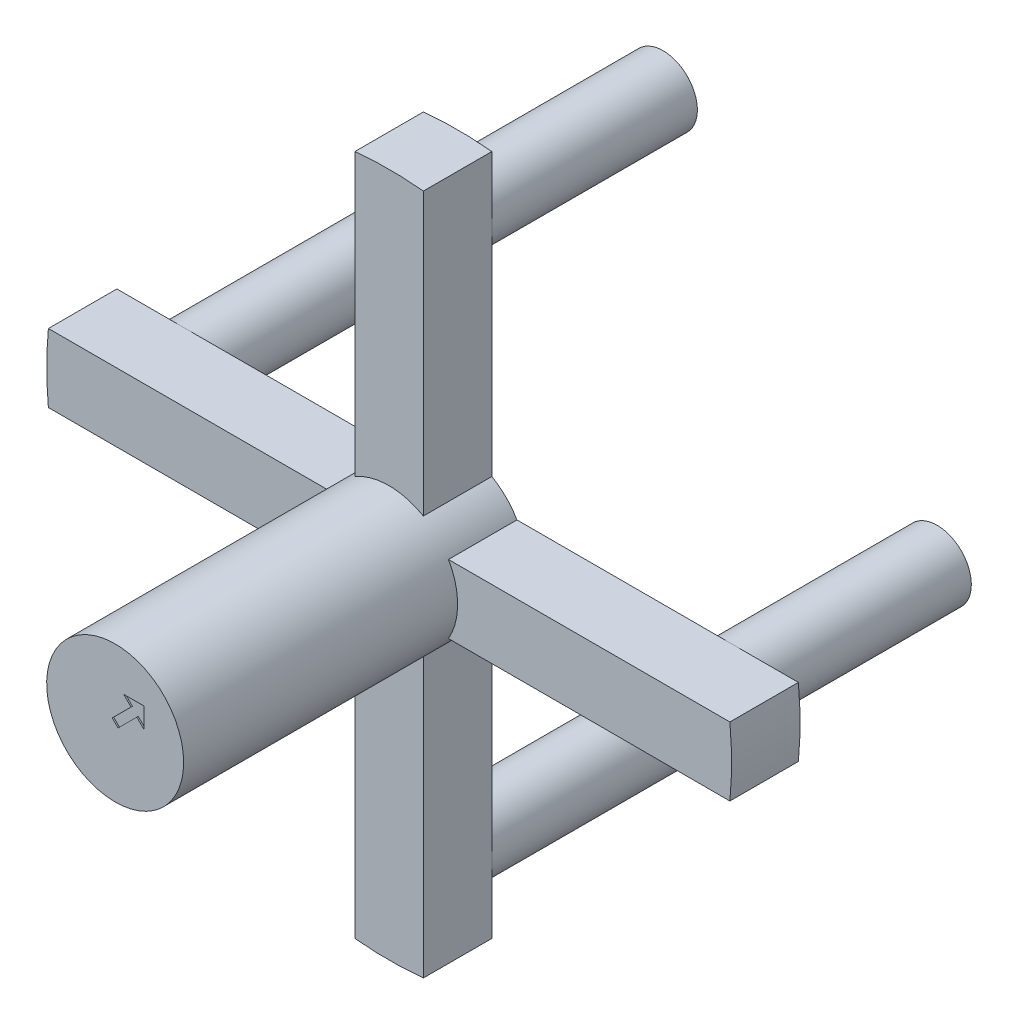
ISO-10303-21;
HEADER;
FILE_DESCRIPTION(('STEP AP214'),'2;1');
FILE_NAME('part.step','',(''),(''),'','','');
FILE_SCHEMA(('AUTOMOTIVE_DESIGN { 1 0 10303 214 1 1 1 1 }'));
ENDSEC;
DATA;
#1=APPLICATION_CONTEXT('core data for automotive mechanical design processes');
#2=APPLICATION_PROTOCOL_DEFINITION('international standard','automotive_design',2000,#1);
#3=PRODUCT_CONTEXT('',#1,'mechanical');
#4=PRODUCT('Part','Part','',(#3));
#5=PRODUCT_RELATED_PRODUCT_CATEGORY('part','',(#4));
#6=PRODUCT_DEFINITION_FORMATION('','',#4);
#7=PRODUCT_DEFINITION_CONTEXT('part definition',#1,'design');
#8=PRODUCT_DEFINITION('design','',#6,#7);
#9=PRODUCT_DEFINITION_SHAPE('','',#8);
#10=(LENGTH_UNIT() NAMED_UNIT(*) SI_UNIT(.MILLI.,.METRE.));
#11=(NAMED_UNIT(*) PLANE_ANGLE_UNIT() SI_UNIT($,.RADIAN.));
#12=(NAMED_UNIT(*) SI_UNIT($,.STERADIAN.) SOLID_ANGLE_UNIT());
#13=UNCERTAINTY_MEASURE_WITH_UNIT(LENGTH_MEASURE(1.E-05),#10,'distance_accuracy_value','');
#14=(GEOMETRIC_REPRESENTATION_CONTEXT(3) GLOBAL_UNCERTAINTY_ASSIGNED_CONTEXT((#13)) GLOBAL_UNIT_ASSIGNED_CONTEXT((#10,
#11,#12)) REPRESENTATION_CONTEXT('',''));
#15=CARTESIAN_POINT('',(0.,0.,0.));
#16=DIRECTION('',(0.,0.,1.));
#17=DIRECTION('',(1.,0.,0.));
#18=AXIS2_PLACEMENT_3D('',#15,#16,#17);
#19=CARTESIAN_POINT('',(0.,0.,20.));
#20=DIRECTION('',(0.,0.,1.));
#21=DIRECTION('',(1.,0.,0.));
#22=AXIS2_PLACEMENT_3D('',#19,#20,#21);
#23=PLANE('',#22);
#24=CARTESIAN_POINT('',(0.,0.,20.));
#25=DIRECTION('',(0.,0.,1.));
#26=DIRECTION('',(1.,0.,0.));
#27=AXIS2_PLACEMENT_3D('',#24,#25,#26);
#28=CIRCLE('',#27,5.);
#29=CARTESIAN_POINT('',(5.,0.,20.));
#30=VERTEX_POINT('',#29);
#31=EDGE_CURVE('E508',#30,#30,#28,.T.);
#32=ORIENTED_EDGE('',*,*,#31,.T.);
#33=EDGE_LOOP('',(#32));
#34=FACE_BOUND('',#33,.T.);
#35=DIRECTION('',(0.70710678118644,0.707106781186655,0.));
#36=VECTOR('',#35,1.);
#37=CARTESIAN_POINT('',(-0.212132034355997,0.212132034355932,20.));
#38=LINE('',#37,#36);
#39=CARTESIAN_POINT('',(-0.212132034355964,0.212132034355965,20.));
#40=VERTEX_POINT('',#39);
#41=CARTESIAN_POINT('',(1.15918830920348,1.58345237791583,20.));
#42=VERTEX_POINT('',#41);
#43=EDGE_CURVE('E272',#40,#42,#38,.T.);
#44=ORIENTED_EDGE('',*,*,#43,.T.);
#45=DIRECTION('',(-0.707106781186654,0.707106781186441,0.));
#46=VECTOR('',#45,1.);
#47=CARTESIAN_POINT('',(1.37132034355948,1.37132034355989,20.));
#48=LINE('',#47,#46);
#49=CARTESIAN_POINT('',(0.621320343559372,2.12132034355977,20.));
#50=VERTEX_POINT('',#49);
#51=EDGE_CURVE('E61',#42,#50,#48,.T.);
#52=ORIENTED_EDGE('',*,*,#51,.T.);
#53=DIRECTION('',(1.,1.49764460092666E-13,0.));
#54=VECTOR('',#53,1.);
#55=CARTESIAN_POINT('',(-3.17698395936805E-13,2.12132034355968,20.));
#56=LINE('',#55,#54);
#57=CARTESIAN_POINT('',(2.12132034355935,2.12132034356,20.));
#58=VERTEX_POINT('',#57);
#59=EDGE_CURVE('E249',#50,#58,#56,.T.);
#60=ORIENTED_EDGE('',*,*,#59,.T.);
#61=DIRECTION('',(1.49764460092666E-13,-1.,0.));
#62=VECTOR('',#61,1.);
#63=CARTESIAN_POINT('',(2.12132034355967,3.17698395936804E-13,20.));
#64=LINE('',#63,#62);
#65=CARTESIAN_POINT('',(2.12132034355958,0.621320343560018,20.));
#66=VERTEX_POINT('',#65);
#67=EDGE_CURVE('E253',#58,#66,#64,.T.);
#68=ORIENTED_EDGE('',*,*,#67,.T.);
#69=DIRECTION('',(-0.707106781186654,0.707106781186441,0.));
#70=VECTOR('',#69,1.);
#71=CARTESIAN_POINT('',(1.37132034355948,1.37132034355989,20.));
#72=LINE('',#71,#70);
#73=CARTESIAN_POINT('',(1.58345237791547,1.15918830920396,20.));
#74=VERTEX_POINT('',#73);
#75=EDGE_CURVE('E283',#66,#74,#72,.T.);
#76=ORIENTED_EDGE('',*,*,#75,.T.);
#77=DIRECTION('',(0.707106781186441,0.707106781186654,0.));
#78=VECTOR('',#77,1.);
#79=CARTESIAN_POINT('',(0.212132034355991,-0.212132034355927,20.));
#80=LINE('',#79,#78);
#81=CARTESIAN_POINT('',(0.212132034356023,-0.212132034355895,20.));
#82=VERTEX_POINT('',#81);
#83=EDGE_CURVE('E279',#82,#74,#80,.T.);
#84=ORIENTED_EDGE('',*,*,#83,.F.);
#85=DIRECTION('',(0.707106781186654,-0.707106781186442,0.));
#86=VECTOR('',#85,1.);
#87=CARTESIAN_POINT('',(0.,0.,20.));
#88=LINE('',#87,#86);
#89=EDGE_CURVE('E275',#40,#82,#88,.T.);
#90=ORIENTED_EDGE('',*,*,#89,.F.);
#91=EDGE_LOOP('',(#44,#52,#60,#68,#76,#84,#90));
#92=FACE_BOUND('',#91,.T.);
#93=ADVANCED_FACE('F45',(#34,#92),#23,.T.);
#94=CARTESIAN_POINT('',(0.,0.,-5.));
#95=DIRECTION('',(0.,0.,-1.));
#96=DIRECTION('',(-1.,0.,0.));
#97=AXIS2_PLACEMENT_3D('',#94,#95,#96);
#98=PLANE('',#97);
#99=DIRECTION('',(0.,-1.,0.));
#100=VECTOR('',#99,1.);
#101=CARTESIAN_POINT('',(-2.5,0.,-5.));
#102=LINE('',#101,#100);
#103=CARTESIAN_POINT('',(-2.49999999999986,-19.9999999999997,-5.));
#104=VERTEX_POINT('',#103);
#105=CARTESIAN_POINT('',(-2.49999999999983,-24.8746859276655,-5.));
#106=VERTEX_POINT('',#105);
#107=EDGE_CURVE('E352',#104,#106,#102,.T.);
#108=ORIENTED_EDGE('',*,*,#107,.F.);
#109=CARTESIAN_POINT('',(0.,-19.9999999999997,-5.));
#110=DIRECTION('',(0.,0.,-1.));
#111=DIRECTION('',(-1.,0.,0.));
#112=AXIS2_PLACEMENT_3D('',#109,#110,#111);
#113=CIRCLE('',#112,2.49999999999966);
#114=CARTESIAN_POINT('',(2.50000000000014,-19.9999999999997,-5.));
#115=VERTEX_POINT('',#114);
#116=EDGE_CURVE('E68',#115,#104,#113,.T.);
#117=ORIENTED_EDGE('',*,*,#116,.F.);
#118=DIRECTION('',(0.,-1.,0.));
#119=VECTOR('',#118,1.);
#120=CARTESIAN_POINT('',(2.5,0.,-5.));
#121=LINE('',#120,#119);
#122=CARTESIAN_POINT('',(2.50000000000017,-24.8746859276655,-5.));
#123=VERTEX_POINT('',#122);
#124=EDGE_CURVE('E342',#115,#123,#121,.T.);
#125=ORIENTED_EDGE('',*,*,#124,.T.);
#126=CARTESIAN_POINT('',(0.,0.,-5.));
#127=DIRECTION('',(0.,0.,-1.));
#128=DIRECTION('',(-1.,0.,0.));
#129=AXIS2_PLACEMENT_3D('',#126,#127,#128);
#130=CIRCLE('',#129,25.);
#131=EDGE_CURVE('E348',#123,#106,#130,.T.);
#132=ORIENTED_EDGE('',*,*,#131,.T.);
#133=EDGE_LOOP('',(#108,#117,#125,#132));
#134=FACE_BOUND('',#133,.T.);
#135=ADVANCED_FACE('F624',(#134),#98,.T.);
#136=CARTESIAN_POINT('',(2.50000000000003,-4.33012701892218,-5.));
#137=VERTEX_POINT('',#136);
#138=EDGE_CURVE('E344',#137,#115,#121,.T.);
#139=ORIENTED_EDGE('',*,*,#138,.T.);
#140=EDGE_CURVE('E308',#104,#115,#113,.T.);
#141=ORIENTED_EDGE('',*,*,#140,.F.);
#142=CARTESIAN_POINT('',(-2.49999999999997,-4.33012701892221,-5.));
#143=VERTEX_POINT('',#142);
#144=EDGE_CURVE('E353',#143,#104,#102,.T.);
#145=ORIENTED_EDGE('',*,*,#144,.F.);
#146=CARTESIAN_POINT('',(0.,0.,-5.));
#147=DIRECTION('',(0.,0.,-1.));
#148=DIRECTION('',(-1.,0.,0.));
#149=AXIS2_PLACEMENT_3D('',#146,#147,#148);
#150=CIRCLE('',#149,5.);
#151=CARTESIAN_POINT('',(-4.33012701892218,-2.50000000000002,-5.));
#152=VERTEX_POINT('',#151);
#153=EDGE_CURVE('E357',#143,#152,#150,.T.);
#154=ORIENTED_EDGE('',*,*,#153,.T.);
#155=DIRECTION('',(-1.,0.,0.));
#156=VECTOR('',#155,1.);
#157=CARTESIAN_POINT('',(0.,-2.5,-5.));
#158=LINE('',#157,#156);
#159=CARTESIAN_POINT('',(-20.,-2.50000000000007,-5.));
#160=VERTEX_POINT('',#159);
#161=EDGE_CURVE('E361',#152,#160,#158,.T.);
#162=ORIENTED_EDGE('',*,*,#161,.T.);
#163=CARTESIAN_POINT('',(-20.,3.29502006961232E-13,-5.));
#164=DIRECTION('',(0.,0.,-1.));
#165=DIRECTION('',(-1.,0.,0.));
#166=AXIS2_PLACEMENT_3D('',#163,#164,#165);
#167=CIRCLE('',#166,2.49999999999998);
#168=CARTESIAN_POINT('',(-20.,2.49999999999993,-5.));
#169=VERTEX_POINT('',#168);
#170=EDGE_CURVE('E315',#169,#160,#167,.T.);
#171=ORIENTED_EDGE('',*,*,#170,.F.);
#172=DIRECTION('',(-1.,0.,0.));
#173=VECTOR('',#172,1.);
#174=CARTESIAN_POINT('',(0.,2.5,-5.));
#175=LINE('',#174,#173);
#176=CARTESIAN_POINT('',(-4.3301270189222,2.49999999999998,-5.));
#177=VERTEX_POINT('',#176);
#178=EDGE_CURVE('E370',#177,#169,#175,.T.);
#179=ORIENTED_EDGE('',*,*,#178,.F.);
#180=CARTESIAN_POINT('',(0.,0.,-5.));
#181=DIRECTION('',(0.,0.,-1.));
#182=DIRECTION('',(-1.,0.,0.));
#183=AXIS2_PLACEMENT_3D('',#180,#181,#182);
#184=CIRCLE('',#183,5.);
#185=CARTESIAN_POINT('',(-2.5,4.33012701892219,-5.));
#186=VERTEX_POINT('',#185);
#187=EDGE_CURVE('E374',#177,#186,#184,.T.);
#188=ORIENTED_EDGE('',*,*,#187,.T.);
#189=DIRECTION('',(0.,1.,0.));
#190=VECTOR('',#189,1.);
#191=CARTESIAN_POINT('',(-2.5,0.,-5.));
#192=LINE('',#191,#190);
#193=CARTESIAN_POINT('',(-2.5,20.,-5.));
#194=VERTEX_POINT('',#193);
#195=EDGE_CURVE('E378',#186,#194,#192,.T.);
#196=ORIENTED_EDGE('',*,*,#195,.T.);
#197=CARTESIAN_POINT('',(-3.00098104168964E-13,20.,-5.));
#198=DIRECTION('',(0.,0.,-1.));
#199=DIRECTION('',(-1.,0.,0.));
#200=AXIS2_PLACEMENT_3D('',#197,#198,#199);
#201=CIRCLE('',#200,2.49999999999978);
#202=CARTESIAN_POINT('',(2.49999999999948,20.,-5.));
#203=VERTEX_POINT('',#202);
#204=EDGE_CURVE('E11',#194,#203,#201,.F.);
#205=ORIENTED_EDGE('',*,*,#204,.T.);
#206=DIRECTION('',(0.,1.,0.));
#207=VECTOR('',#206,1.);
#208=CARTESIAN_POINT('',(2.5,0.,-5.));
#209=LINE('',#208,#207);
#210=CARTESIAN_POINT('',(2.5,4.33012701892219,-5.));
#211=VERTEX_POINT('',#210);
#212=EDGE_CURVE('E387',#211,#203,#209,.T.);
#213=ORIENTED_EDGE('',*,*,#212,.F.);
#214=CARTESIAN_POINT('',(0.,0.,-5.));
#215=DIRECTION('',(0.,0.,-1.));
#216=DIRECTION('',(-1.,0.,0.));
#217=AXIS2_PLACEMENT_3D('',#214,#215,#216);
#218=CIRCLE('',#217,5.);
#219=CARTESIAN_POINT('',(4.33012701892217,2.50000000000005,-5.));
#220=VERTEX_POINT('',#219);
#221=EDGE_CURVE('E391',#211,#220,#218,.T.);
#222=ORIENTED_EDGE('',*,*,#221,.T.);
#223=DIRECTION('',(1.,0.,0.));
#224=VECTOR('',#223,1.);
#225=CARTESIAN_POINT('',(0.,2.5,-5.));
#226=LINE('',#225,#224);
#227=CARTESIAN_POINT('',(20.,2.50000000000001,-5.));
#228=VERTEX_POINT('',#227);
#229=EDGE_CURVE('E395',#220,#228,#226,.T.);
#230=ORIENTED_EDGE('',*,*,#229,.T.);
#231=CARTESIAN_POINT('',(20.,2.30268477392101E-13,-5.));
#232=DIRECTION('',(0.,0.,-1.));
#233=DIRECTION('',(-1.,0.,0.));
#234=AXIS2_PLACEMENT_3D('',#231,#232,#233);
#235=CIRCLE('',#234,2.49999999999978);
#236=CARTESIAN_POINT('',(20.,-2.49999999999979,-5.));
#237=VERTEX_POINT('',#236);
#238=EDGE_CURVE('E54',#237,#228,#235,.T.);
#239=ORIENTED_EDGE('',*,*,#238,.F.);
#240=DIRECTION('',(1.,0.,0.));
#241=VECTOR('',#240,1.);
#242=CARTESIAN_POINT('',(0.,-2.5,-5.));
#243=LINE('',#242,#241);
#244=CARTESIAN_POINT('',(4.33012701892222,-2.49999999999996,-5.));
#245=VERTEX_POINT('',#244);
#246=EDGE_CURVE('E403',#245,#237,#243,.T.);
#247=ORIENTED_EDGE('',*,*,#246,.F.);
#248=CARTESIAN_POINT('',(0.,0.,-5.));
#249=DIRECTION('',(0.,0.,-1.));
#250=DIRECTION('',(-1.,0.,0.));
#251=AXIS2_PLACEMENT_3D('',#248,#249,#250);
#252=CIRCLE('',#251,5.);
#253=EDGE_CURVE('E338',#245,#137,#252,.T.);
#254=ORIENTED_EDGE('',*,*,#253,.T.);
#255=EDGE_LOOP('',(#139,#141,#145,#154,#162,#171,#179,#188,#196,#205,#213,#222,#230,#239,#247,#254));
#256=FACE_BOUND('',#255,.T.);
#257=ADVANCED_FACE('F556',(#256),#98,.T.);
#258=CARTESIAN_POINT('',(-24.8746859276655,2.49999999999991,-5.));
#259=VERTEX_POINT('',#258);
#260=EDGE_CURVE('E369',#169,#259,#175,.T.);
#261=ORIENTED_EDGE('',*,*,#260,.F.);
#262=EDGE_CURVE('E319',#160,#169,#167,.T.);
#263=ORIENTED_EDGE('',*,*,#262,.F.);
#264=CARTESIAN_POINT('',(-24.8746859276655,-2.50000000000009,-5.));
#265=VERTEX_POINT('',#264);
#266=EDGE_CURVE('E360',#160,#265,#158,.T.);
#267=ORIENTED_EDGE('',*,*,#266,.T.);
#268=CARTESIAN_POINT('',(0.,0.,-5.));
#269=DIRECTION('',(0.,0.,-1.));
#270=DIRECTION('',(-1.,0.,0.));
#271=AXIS2_PLACEMENT_3D('',#268,#269,#270);
#272=CIRCLE('',#271,25.);
#273=EDGE_CURVE('E365',#265,#259,#272,.T.);
#274=ORIENTED_EDGE('',*,*,#273,.T.);
#275=EDGE_LOOP('',(#261,#263,#267,#274));
#276=FACE_BOUND('',#275,.T.);
#277=ADVANCED_FACE('F544',(#276),#98,.T.);
#278=EDGE_CURVE('E326',#228,#237,#235,.T.);
#279=ORIENTED_EDGE('',*,*,#278,.F.);
#280=CARTESIAN_POINT('',(24.8746859276655,2.50000000000026,-5.));
#281=VERTEX_POINT('',#280);
#282=EDGE_CURVE('E394',#228,#281,#226,.T.);
#283=ORIENTED_EDGE('',*,*,#282,.T.);
#284=CARTESIAN_POINT('',(0.,0.,-5.));
#285=DIRECTION('',(0.,0.,-1.));
#286=DIRECTION('',(-1.,0.,0.));
#287=AXIS2_PLACEMENT_3D('',#284,#285,#286);
#288=CIRCLE('',#287,25.);
#289=CARTESIAN_POINT('',(24.8746859276655,-2.49999999999974,-5.));
#290=VERTEX_POINT('',#289);
#291=EDGE_CURVE('E398',#281,#290,#288,.T.);
#292=ORIENTED_EDGE('',*,*,#291,.T.);
#293=EDGE_CURVE('E402',#237,#290,#243,.T.);
#294=ORIENTED_EDGE('',*,*,#293,.F.);
#295=EDGE_LOOP('',(#279,#283,#292,#294));
#296=FACE_BOUND('',#295,.T.);
#297=ADVANCED_FACE('F581',(#296),#98,.T.);
#298=CARTESIAN_POINT('',(0.,0.,20.));
#299=DIRECTION('',(0.,0.,-1.));
#300=DIRECTION('',(-1.,0.,0.));
#301=AXIS2_PLACEMENT_3D('',#298,#299,#300);
#302=CYLINDRICAL_SURFACE('',#301,5.);
#303=ORIENTED_EDGE('',*,*,#31,.F.);
#304=EDGE_LOOP('',(#303));
#305=FACE_BOUND('',#304,.T.);
#306=CARTESIAN_POINT('',(0.,0.,0.));
#307=DIRECTION('',(0.,0.,1.));
#308=DIRECTION('',(1.,0.,0.));
#309=AXIS2_PLACEMENT_3D('',#306,#307,#308);
#310=CIRCLE('',#309,5.);
#311=CARTESIAN_POINT('',(4.33012701892222,-2.49999999999996,0.));
#312=VERTEX_POINT('',#311);
#313=CARTESIAN_POINT('',(4.33012701892217,2.50000000000005,0.));
#314=VERTEX_POINT('',#313);
#315=EDGE_CURVE('E507',#312,#314,#310,.T.);
#316=ORIENTED_EDGE('',*,*,#315,.T.);
#317=DIRECTION('',(0.,0.,1.));
#318=VECTOR('',#317,1.);
#319=CARTESIAN_POINT('',(4.33012701892217,2.50000000000005,-5.));
#320=LINE('',#319,#318);
#321=EDGE_CURVE('E460',#220,#314,#320,.T.);
#322=ORIENTED_EDGE('',*,*,#321,.F.);
#323=ORIENTED_EDGE('',*,*,#221,.F.);
#324=DIRECTION('',(0.,0.,1.));
#325=VECTOR('',#324,1.);
#326=CARTESIAN_POINT('',(2.5,4.33012701892219,-5.));
#327=LINE('',#326,#325);
#328=CARTESIAN_POINT('',(2.5,4.33012701892219,0.));
#329=VERTEX_POINT('',#328);
#330=EDGE_CURVE('E464',#211,#329,#327,.T.);
#331=ORIENTED_EDGE('',*,*,#330,.T.);
#332=CARTESIAN_POINT('',(-2.5,4.33012701892219,0.));
#333=VERTEX_POINT('',#332);
#334=EDGE_CURVE('E511',#329,#333,#310,.T.);
#335=ORIENTED_EDGE('',*,*,#334,.T.);
#336=DIRECTION('',(0.,0.,1.));
#337=VECTOR('',#336,1.);
#338=CARTESIAN_POINT('',(-2.5,4.33012701892219,-5.));
#339=LINE('',#338,#337);
#340=EDGE_CURVE('E475',#186,#333,#339,.T.);
#341=ORIENTED_EDGE('',*,*,#340,.F.);
#342=ORIENTED_EDGE('',*,*,#187,.F.);
#343=DIRECTION('',(0.,0.,1.));
#344=VECTOR('',#343,1.);
#345=CARTESIAN_POINT('',(-4.3301270189222,2.49999999999998,-5.));
#346=LINE('',#345,#344);
#347=CARTESIAN_POINT('',(-4.3301270189222,2.49999999999998,0.));
#348=VERTEX_POINT('',#347);
#349=EDGE_CURVE('E478',#177,#348,#346,.T.);
#350=ORIENTED_EDGE('',*,*,#349,.T.);
#351=CARTESIAN_POINT('',(-4.33012701892218,-2.50000000000002,0.));
#352=VERTEX_POINT('',#351);
#353=EDGE_CURVE('E519',#348,#352,#310,.T.);
#354=ORIENTED_EDGE('',*,*,#353,.T.);
#355=DIRECTION('',(0.,0.,1.));
#356=VECTOR('',#355,1.);
#357=CARTESIAN_POINT('',(-4.33012701892218,-2.50000000000002,-5.));
#358=LINE('',#357,#356);
#359=EDGE_CURVE('E489',#152,#352,#358,.T.);
#360=ORIENTED_EDGE('',*,*,#359,.F.);
#361=ORIENTED_EDGE('',*,*,#153,.F.);
#362=DIRECTION('',(0.,0.,1.));
#363=VECTOR('',#362,1.);
#364=CARTESIAN_POINT('',(-2.49999999999997,-4.33012701892221,-5.));
#365=LINE('',#364,#363);
#366=CARTESIAN_POINT('',(-2.49999999999997,-4.33012701892221,0.));
#367=VERTEX_POINT('',#366);
#368=EDGE_CURVE('E492',#143,#367,#365,.T.);
#369=ORIENTED_EDGE('',*,*,#368,.T.);
#370=CARTESIAN_POINT('',(2.50000000000003,-4.33012701892218,0.));
#371=VERTEX_POINT('',#370);
#372=EDGE_CURVE('E514',#367,#371,#310,.T.);
#373=ORIENTED_EDGE('',*,*,#372,.T.);
#374=DIRECTION('',(0.,0.,1.));
#375=VECTOR('',#374,1.);
#376=CARTESIAN_POINT('',(2.50000000000003,-4.33012701892218,-5.));
#377=LINE('',#376,#375);
#378=EDGE_CURVE('E503',#137,#371,#377,.T.);
#379=ORIENTED_EDGE('',*,*,#378,.F.);
#380=ORIENTED_EDGE('',*,*,#253,.F.);
#381=DIRECTION('',(0.,0.,1.));
#382=VECTOR('',#381,1.);
#383=CARTESIAN_POINT('',(4.33012701892222,-2.49999999999996,-5.));
#384=LINE('',#383,#382);
#385=EDGE_CURVE('E407',#245,#312,#384,.T.);
#386=ORIENTED_EDGE('',*,*,#385,.T.);
#387=EDGE_LOOP('',(#316,#322,#323,#331,#335,#341,#342,#350,#354,#360,#361,#369,#373,#379,#380,#386));
#388=FACE_BOUND('',#387,.T.);
#389=ADVANCED_FACE('F47',(#305,#388),#302,.T.);
#390=CARTESIAN_POINT('',(0.,0.,0.));
#391=DIRECTION('',(0.,0.,-1.));
#392=DIRECTION('',(-1.,0.,0.));
#393=AXIS2_PLACEMENT_3D('',#390,#391,#392);
#394=PLANE('',#393);
#395=ORIENTED_EDGE('',*,*,#334,.F.);
#396=DIRECTION('',(0.,1.,0.));
#397=VECTOR('',#396,1.);
#398=CARTESIAN_POINT('',(2.5,0.,0.));
#399=LINE('',#398,#397);
#400=CARTESIAN_POINT('',(2.5,24.8746859276655,0.));
#401=VERTEX_POINT('',#400);
#402=EDGE_CURVE('E436',#329,#401,#399,.T.);
#403=ORIENTED_EDGE('',*,*,#402,.T.);
#404=CARTESIAN_POINT('',(0.,0.,0.));
#405=DIRECTION('',(0.,0.,-1.));
#406=DIRECTION('',(-1.,0.,0.));
#407=AXIS2_PLACEMENT_3D('',#404,#405,#406);
#408=CIRCLE('',#407,25.);
#409=CARTESIAN_POINT('',(-2.5,24.8746859276655,0.));
#410=VERTEX_POINT('',#409);
#411=EDGE_CURVE('E432',#410,#401,#408,.T.);
#412=ORIENTED_EDGE('',*,*,#411,.F.);
#413=DIRECTION('',(0.,1.,0.));
#414=VECTOR('',#413,1.);
#415=CARTESIAN_POINT('',(-2.5,0.,0.));
#416=LINE('',#415,#414);
#417=EDGE_CURVE('E429',#333,#410,#416,.T.);
#418=ORIENTED_EDGE('',*,*,#417,.F.);
#419=EDGE_LOOP('',(#395,#403,#412,#418));
#420=FACE_BOUND('',#419,.T.);
#421=ADVANCED_FACE('F670',(#420),#394,.F.);
#422=ORIENTED_EDGE('',*,*,#353,.F.);
#423=DIRECTION('',(-1.,0.,0.));
#424=VECTOR('',#423,1.);
#425=CARTESIAN_POINT('',(0.,2.5,0.));
#426=LINE('',#425,#424);
#427=CARTESIAN_POINT('',(-24.8746859276655,2.49999999999991,0.));
#428=VERTEX_POINT('',#427);
#429=EDGE_CURVE('E425',#348,#428,#426,.T.);
#430=ORIENTED_EDGE('',*,*,#429,.T.);
#431=CARTESIAN_POINT('',(0.,0.,0.));
#432=DIRECTION('',(0.,0.,-1.));
#433=DIRECTION('',(-1.,0.,0.));
#434=AXIS2_PLACEMENT_3D('',#431,#432,#433);
#435=CIRCLE('',#434,25.);
#436=CARTESIAN_POINT('',(-24.8746859276655,-2.50000000000009,0.));
#437=VERTEX_POINT('',#436);
#438=EDGE_CURVE('E421',#437,#428,#435,.T.);
#439=ORIENTED_EDGE('',*,*,#438,.F.);
#440=DIRECTION('',(-1.,0.,0.));
#441=VECTOR('',#440,1.);
#442=CARTESIAN_POINT('',(0.,-2.5,0.));
#443=LINE('',#442,#441);
#444=EDGE_CURVE('E418',#352,#437,#443,.T.);
#445=ORIENTED_EDGE('',*,*,#444,.F.);
#446=EDGE_LOOP('',(#422,#430,#439,#445));
#447=FACE_BOUND('',#446,.T.);
#448=ADVANCED_FACE('F532',(#447),#394,.F.);
#449=ORIENTED_EDGE('',*,*,#372,.F.);
#450=DIRECTION('',(0.,-1.,0.));
#451=VECTOR('',#450,1.);
#452=CARTESIAN_POINT('',(-2.5,0.,0.));
#453=LINE('',#452,#451);
#454=CARTESIAN_POINT('',(-2.49999999999983,-24.8746859276655,0.));
#455=VERTEX_POINT('',#454);
#456=EDGE_CURVE('E414',#367,#455,#453,.T.);
#457=ORIENTED_EDGE('',*,*,#456,.T.);
#458=CARTESIAN_POINT('',(0.,0.,0.));
#459=DIRECTION('',(0.,0.,-1.));
#460=DIRECTION('',(-1.,0.,0.));
#461=AXIS2_PLACEMENT_3D('',#458,#459,#460);
#462=CIRCLE('',#461,25.);
#463=CARTESIAN_POINT('',(2.50000000000017,-24.8746859276655,0.));
#464=VERTEX_POINT('',#463);
#465=EDGE_CURVE('E410',#464,#455,#462,.T.);
#466=ORIENTED_EDGE('',*,*,#465,.F.);
#467=DIRECTION('',(0.,-1.,0.));
#468=VECTOR('',#467,1.);
#469=CARTESIAN_POINT('',(2.5,0.,0.));
#470=LINE('',#469,#468);
#471=EDGE_CURVE('E334',#371,#464,#470,.T.);
#472=ORIENTED_EDGE('',*,*,#471,.F.);
#473=EDGE_LOOP('',(#449,#457,#466,#472));
#474=FACE_BOUND('',#473,.T.);
#475=ADVANCED_FACE('F565',(#474),#394,.F.);
#476=CARTESIAN_POINT('',(2.5,0.,-5.));
#477=DIRECTION('',(-1.,0.,0.));
#478=DIRECTION('',(0.,-1.,0.));
#479=AXIS2_PLACEMENT_3D('',#476,#477,#478);
#480=PLANE('',#479);
#481=ORIENTED_EDGE('',*,*,#471,.T.);
#482=DIRECTION('',(0.,0.,1.));
#483=VECTOR('',#482,1.);
#484=CARTESIAN_POINT('',(2.50000000000017,-24.8746859276655,-5.));
#485=LINE('',#484,#483);
#486=EDGE_CURVE('E499',#123,#464,#485,.T.);
#487=ORIENTED_EDGE('',*,*,#486,.F.);
#488=ORIENTED_EDGE('',*,*,#124,.F.);
#489=ORIENTED_EDGE('',*,*,#138,.F.);
#490=ORIENTED_EDGE('',*,*,#378,.T.);
#491=EDGE_LOOP('',(#481,#487,#488,#489,#490));
#492=FACE_BOUND('',#491,.T.);
#493=ADVANCED_FACE('F568',(#492),#480,.F.);
#494=CARTESIAN_POINT('',(0.,0.,-5.));
#495=DIRECTION('',(0.,0.,1.));
#496=DIRECTION('',(1.,0.,0.));
#497=AXIS2_PLACEMENT_3D('',#494,#495,#496);
#498=CYLINDRICAL_SURFACE('',#497,25.);
#499=ORIENTED_EDGE('',*,*,#465,.T.);
#500=DIRECTION('',(0.,0.,1.));
#501=VECTOR('',#500,1.);
#502=CARTESIAN_POINT('',(-2.49999999999983,-24.8746859276655,-5.));
#503=LINE('',#502,#501);
#504=EDGE_CURVE('E496',#106,#455,#503,.T.);
#505=ORIENTED_EDGE('',*,*,#504,.F.);
#506=ORIENTED_EDGE('',*,*,#131,.F.);
#507=ORIENTED_EDGE('',*,*,#486,.T.);
#508=EDGE_LOOP('',(#499,#505,#506,#507));
#509=FACE_BOUND('',#508,.T.);
#510=ADVANCED_FACE('F635',(#509),#498,.T.);
#511=CARTESIAN_POINT('',(-2.5,0.,-5.));
#512=DIRECTION('',(-1.,0.,0.));
#513=DIRECTION('',(0.,-1.,0.));
#514=AXIS2_PLACEMENT_3D('',#511,#512,#513);
#515=PLANE('',#514);
#516=ORIENTED_EDGE('',*,*,#456,.F.);
#517=ORIENTED_EDGE('',*,*,#368,.F.);
#518=ORIENTED_EDGE('',*,*,#144,.T.);
#519=ORIENTED_EDGE('',*,*,#107,.T.);
#520=ORIENTED_EDGE('',*,*,#504,.T.);
#521=EDGE_LOOP('',(#516,#517,#518,#519,#520));
#522=FACE_BOUND('',#521,.T.);
#523=ADVANCED_FACE('F561',(#522),#515,.T.);
#524=CARTESIAN_POINT('',(0.,-2.5,-5.));
#525=DIRECTION('',(0.,1.,0.));
#526=DIRECTION('',(-1.,0.,0.));
#527=AXIS2_PLACEMENT_3D('',#524,#525,#526);
#528=PLANE('',#527);
#529=ORIENTED_EDGE('',*,*,#444,.T.);
#530=DIRECTION('',(0.,0.,1.));
#531=VECTOR('',#530,1.);
#532=CARTESIAN_POINT('',(-24.8746859276655,-2.50000000000009,-5.));
#533=LINE('',#532,#531);
#534=EDGE_CURVE('E485',#265,#437,#533,.T.);
#535=ORIENTED_EDGE('',*,*,#534,.F.);
#536=ORIENTED_EDGE('',*,*,#266,.F.);
#537=ORIENTED_EDGE('',*,*,#161,.F.);
#538=ORIENTED_EDGE('',*,*,#359,.T.);
#539=EDGE_LOOP('',(#529,#535,#536,#537,#538));
#540=FACE_BOUND('',#539,.T.);
#541=ADVANCED_FACE('F536',(#540),#528,.F.);
#542=CARTESIAN_POINT('',(0.,0.,-5.));
#543=DIRECTION('',(0.,0.,1.));
#544=DIRECTION('',(1.,0.,0.));
#545=AXIS2_PLACEMENT_3D('',#542,#543,#544);
#546=CYLINDRICAL_SURFACE('',#545,25.);
#547=ORIENTED_EDGE('',*,*,#438,.T.);
#548=DIRECTION('',(0.,0.,1.));
#549=VECTOR('',#548,1.);
#550=CARTESIAN_POINT('',(-24.8746859276655,2.49999999999991,-5.));
#551=LINE('',#550,#549);
#552=EDGE_CURVE('E482',#259,#428,#551,.T.);
#553=ORIENTED_EDGE('',*,*,#552,.F.);
#554=ORIENTED_EDGE('',*,*,#273,.F.);
#555=ORIENTED_EDGE('',*,*,#534,.T.);
#556=EDGE_LOOP('',(#547,#553,#554,#555));
#557=FACE_BOUND('',#556,.T.);
#558=ADVANCED_FACE('F540',(#557),#546,.T.);
#559=CARTESIAN_POINT('',(0.,2.5,-5.));
#560=DIRECTION('',(0.,1.,0.));
#561=DIRECTION('',(-1.,0.,0.));
#562=AXIS2_PLACEMENT_3D('',#559,#560,#561);
#563=PLANE('',#562);
#564=ORIENTED_EDGE('',*,*,#429,.F.);
#565=ORIENTED_EDGE('',*,*,#349,.F.);
#566=ORIENTED_EDGE('',*,*,#178,.T.);
#567=ORIENTED_EDGE('',*,*,#260,.T.);
#568=ORIENTED_EDGE('',*,*,#552,.T.);
#569=EDGE_LOOP('',(#564,#565,#566,#567,#568));
#570=FACE_BOUND('',#569,.T.);
#571=ADVANCED_FACE('F592',(#570),#563,.T.);
#572=CARTESIAN_POINT('',(-2.5,0.,-5.));
#573=DIRECTION('',(1.,0.,0.));
#574=DIRECTION('',(0.,0.,-1.));
#575=AXIS2_PLACEMENT_3D('',#572,#573,#574);
#576=PLANE('',#575);
#577=ORIENTED_EDGE('',*,*,#417,.T.);
#578=DIRECTION('',(0.,0.,1.));
#579=VECTOR('',#578,1.);
#580=CARTESIAN_POINT('',(-2.5,24.8746859276655,-5.));
#581=LINE('',#580,#579);
#582=CARTESIAN_POINT('',(-2.5,24.8746859276655,-5.));
#583=VERTEX_POINT('',#582);
#584=EDGE_CURVE('E471',#583,#410,#581,.T.);
#585=ORIENTED_EDGE('',*,*,#584,.F.);
#586=EDGE_CURVE('E377',#194,#583,#192,.T.);
#587=ORIENTED_EDGE('',*,*,#586,.F.);
#588=ORIENTED_EDGE('',*,*,#195,.F.);
#589=ORIENTED_EDGE('',*,*,#340,.T.);
#590=EDGE_LOOP('',(#577,#585,#587,#588,#589));
#591=FACE_BOUND('',#590,.T.);
#592=ADVANCED_FACE('F598',(#591),#576,.F.);
#593=CARTESIAN_POINT('',(0.,0.,-5.));
#594=DIRECTION('',(0.,0.,1.));
#595=DIRECTION('',(1.,0.,0.));
#596=AXIS2_PLACEMENT_3D('',#593,#594,#595);
#597=CYLINDRICAL_SURFACE('',#596,25.);
#598=ORIENTED_EDGE('',*,*,#411,.T.);
#599=DIRECTION('',(0.,0.,1.));
#600=VECTOR('',#599,1.);
#601=CARTESIAN_POINT('',(2.5,24.8746859276655,-5.));
#602=LINE('',#601,#600);
#603=CARTESIAN_POINT('',(2.5,24.8746859276655,-5.));
#604=VERTEX_POINT('',#603);
#605=EDGE_CURVE('E468',#604,#401,#602,.T.);
#606=ORIENTED_EDGE('',*,*,#605,.F.);
#607=CARTESIAN_POINT('',(0.,0.,-5.));
#608=DIRECTION('',(0.,0.,-1.));
#609=DIRECTION('',(-1.,0.,0.));
#610=AXIS2_PLACEMENT_3D('',#607,#608,#609);
#611=CIRCLE('',#610,25.);
#612=EDGE_CURVE('E382',#583,#604,#611,.T.);
#613=ORIENTED_EDGE('',*,*,#612,.F.);
#614=ORIENTED_EDGE('',*,*,#584,.T.);
#615=EDGE_LOOP('',(#598,#606,#613,#614));
#616=FACE_BOUND('',#615,.T.);
#617=ADVANCED_FACE('F649',(#616),#597,.T.);
#618=CARTESIAN_POINT('',(2.5,0.,-5.));
#619=DIRECTION('',(1.,0.,0.));
#620=DIRECTION('',(0.,0.,-1.));
#621=AXIS2_PLACEMENT_3D('',#618,#619,#620);
#622=PLANE('',#621);
#623=ORIENTED_EDGE('',*,*,#402,.F.);
#624=ORIENTED_EDGE('',*,*,#330,.F.);
#625=ORIENTED_EDGE('',*,*,#212,.T.);
#626=EDGE_CURVE('E386',#203,#604,#209,.T.);
#627=ORIENTED_EDGE('',*,*,#626,.T.);
#628=ORIENTED_EDGE('',*,*,#605,.T.);
#629=EDGE_LOOP('',(#623,#624,#625,#627,#628));
#630=FACE_BOUND('',#629,.T.);
#631=ADVANCED_FACE('F652',(#630),#622,.T.);
#632=CARTESIAN_POINT('',(0.,2.5,-5.));
#633=DIRECTION('',(0.,-1.,0.));
#634=DIRECTION('',(1.,0.,0.));
#635=AXIS2_PLACEMENT_3D('',#632,#633,#634);
#636=PLANE('',#635);
#637=DIRECTION('',(1.,0.,0.));
#638=VECTOR('',#637,1.);
#639=CARTESIAN_POINT('',(0.,2.5,0.));
#640=LINE('',#639,#638);
#641=CARTESIAN_POINT('',(24.8746859276655,2.50000000000026,0.));
#642=VERTEX_POINT('',#641);
#643=EDGE_CURVE('E440',#314,#642,#640,.T.);
#644=ORIENTED_EDGE('',*,*,#643,.T.);
#645=DIRECTION('',(0.,0.,1.));
#646=VECTOR('',#645,1.);
#647=CARTESIAN_POINT('',(24.8746859276655,2.50000000000026,-5.));
#648=LINE('',#647,#646);
#649=EDGE_CURVE('E456',#281,#642,#648,.T.);
#650=ORIENTED_EDGE('',*,*,#649,.F.);
#651=ORIENTED_EDGE('',*,*,#282,.F.);
#652=ORIENTED_EDGE('',*,*,#229,.F.);
#653=ORIENTED_EDGE('',*,*,#321,.T.);
#654=EDGE_LOOP('',(#644,#650,#651,#652,#653));
#655=FACE_BOUND('',#654,.T.);
#656=ADVANCED_FACE('F656',(#655),#636,.F.);
#657=CARTESIAN_POINT('',(0.,0.,-5.));
#658=DIRECTION('',(0.,0.,1.));
#659=DIRECTION('',(1.,0.,0.));
#660=AXIS2_PLACEMENT_3D('',#657,#658,#659);
#661=CYLINDRICAL_SURFACE('',#660,25.);
#662=CARTESIAN_POINT('',(0.,0.,0.));
#663=DIRECTION('',(0.,0.,-1.));
#664=DIRECTION('',(-1.,0.,0.));
#665=AXIS2_PLACEMENT_3D('',#662,#663,#664);
#666=CIRCLE('',#665,25.);
#667=CARTESIAN_POINT('',(24.8746859276655,-2.49999999999974,0.));
#668=VERTEX_POINT('',#667);
#669=EDGE_CURVE('E443',#642,#668,#666,.T.);
#670=ORIENTED_EDGE('',*,*,#669,.T.);
#671=DIRECTION('',(0.,0.,1.));
#672=VECTOR('',#671,1.);
#673=CARTESIAN_POINT('',(24.8746859276655,-2.49999999999974,-5.));
#674=LINE('',#673,#672);
#675=EDGE_CURVE('E453',#290,#668,#674,.T.);
#676=ORIENTED_EDGE('',*,*,#675,.F.);
#677=ORIENTED_EDGE('',*,*,#291,.F.);
#678=ORIENTED_EDGE('',*,*,#649,.T.);
#679=EDGE_LOOP('',(#670,#676,#677,#678));
#680=FACE_BOUND('',#679,.T.);
#681=ADVANCED_FACE('F660',(#680),#661,.T.);
#682=CARTESIAN_POINT('',(0.,-2.5,-5.));
#683=DIRECTION('',(0.,-1.,0.));
#684=DIRECTION('',(1.,0.,0.));
#685=AXIS2_PLACEMENT_3D('',#682,#683,#684);
#686=PLANE('',#685);
#687=DIRECTION('',(1.,0.,0.));
#688=VECTOR('',#687,1.);
#689=CARTESIAN_POINT('',(0.,-2.5,0.));
#690=LINE('',#689,#688);
#691=EDGE_CURVE('E343',#312,#668,#690,.T.);
#692=ORIENTED_EDGE('',*,*,#691,.F.);
#693=ORIENTED_EDGE('',*,*,#385,.F.);
#694=ORIENTED_EDGE('',*,*,#246,.T.);
#695=ORIENTED_EDGE('',*,*,#293,.T.);
#696=ORIENTED_EDGE('',*,*,#675,.T.);
#697=EDGE_LOOP('',(#692,#693,#694,#695,#696));
#698=FACE_BOUND('',#697,.T.);
#699=ADVANCED_FACE('F576',(#698),#686,.T.);
#700=ORIENTED_EDGE('',*,*,#626,.F.);
#701=CARTESIAN_POINT('',(-3.00098104168964E-13,20.,-5.));
#702=DIRECTION('',(0.,0.,-1.));
#703=DIRECTION('',(-1.,0.,0.));
#704=AXIS2_PLACEMENT_3D('',#701,#702,#703);
#705=CIRCLE('',#704,2.49999999999978);
#706=EDGE_CURVE('E323',#194,#203,#705,.T.);
#707=ORIENTED_EDGE('',*,*,#706,.F.);
#708=ORIENTED_EDGE('',*,*,#586,.T.);
#709=ORIENTED_EDGE('',*,*,#612,.T.);
#710=EDGE_LOOP('',(#700,#707,#708,#709));
#711=FACE_BOUND('',#710,.T.);
#712=ADVANCED_FACE('F604',(#711),#98,.T.);
#713=ORIENTED_EDGE('',*,*,#315,.F.);
#714=ORIENTED_EDGE('',*,*,#691,.T.);
#715=ORIENTED_EDGE('',*,*,#669,.F.);
#716=ORIENTED_EDGE('',*,*,#643,.F.);
#717=EDGE_LOOP('',(#713,#714,#715,#716));
#718=FACE_BOUND('',#717,.T.);
#719=ADVANCED_FACE('F667',(#718),#394,.F.);
#720=CARTESIAN_POINT('',(20.,2.30268477392101E-13,-20.));
#721=DIRECTION('',(0.,0.,1.));
#722=DIRECTION('',(1.,0.,0.));
#723=AXIS2_PLACEMENT_3D('',#720,#721,#722);
#724=CYLINDRICAL_SURFACE('',#723,2.49999999999978);
#725=CARTESIAN_POINT('',(20.,2.30268477392101E-13,-20.));
#726=DIRECTION('',(0.,0.,-1.));
#727=DIRECTION('',(-1.,0.,0.));
#728=AXIS2_PLACEMENT_3D('',#725,#726,#727);
#729=CIRCLE('',#728,2.49999999999978);
#730=CARTESIAN_POINT('',(17.5000000000002,2.30268477392101E-13,-20.));
#731=VERTEX_POINT('',#730);
#732=EDGE_CURVE('E330',#731,#731,#729,.T.);
#733=ORIENTED_EDGE('',*,*,#732,.F.);
#734=EDGE_LOOP('',(#733));
#735=FACE_BOUND('',#734,.T.);
#736=ORIENTED_EDGE('',*,*,#278,.T.);
#737=ORIENTED_EDGE('',*,*,#238,.T.);
#738=EDGE_LOOP('',(#736,#737));
#739=FACE_BOUND('',#738,.T.);
#740=ADVANCED_FACE('F579',(#735,#739),#724,.T.);
#741=CARTESIAN_POINT('',(20.,2.30268477392101E-13,-20.));
#742=DIRECTION('',(0.,0.,-1.));
#743=DIRECTION('',(-1.,0.,0.));
#744=AXIS2_PLACEMENT_3D('',#741,#742,#743);
#745=PLANE('',#744);
#746=ORIENTED_EDGE('',*,*,#732,.T.);
#747=EDGE_LOOP('',(#746));
#748=FACE_BOUND('',#747,.T.);
#749=ADVANCED_FACE('F610',(#748),#745,.T.);
#750=CARTESIAN_POINT('',(-3.00098104168964E-13,20.,-20.));
#751=DIRECTION('',(0.,0.,1.));
#752=DIRECTION('',(1.,0.,0.));
#753=AXIS2_PLACEMENT_3D('',#750,#751,#752);
#754=CYLINDRICAL_SURFACE('',#753,2.49999999999978);
#755=CARTESIAN_POINT('',(-3.00098104168964E-13,20.,-20.));
#756=DIRECTION('',(0.,0.,-1.));
#757=DIRECTION('',(-1.,0.,0.));
#758=AXIS2_PLACEMENT_3D('',#755,#756,#757);
#759=CIRCLE('',#758,2.49999999999978);
#760=CARTESIAN_POINT('',(-2.50000000000008,20.,-20.));
#761=VERTEX_POINT('',#760);
#762=EDGE_CURVE('E318',#761,#761,#759,.T.);
#763=ORIENTED_EDGE('',*,*,#762,.F.);
#764=EDGE_LOOP('',(#763));
#765=FACE_BOUND('',#764,.T.);
#766=ORIENTED_EDGE('',*,*,#706,.T.);
#767=ORIENTED_EDGE('',*,*,#204,.F.);
#768=EDGE_LOOP('',(#766,#767));
#769=FACE_BOUND('',#768,.T.);
#770=ADVANCED_FACE('F607',(#765,#769),#754,.T.);
#771=CARTESIAN_POINT('',(-3.00098104168964E-13,20.,-20.));
#772=DIRECTION('',(0.,0.,-1.));
#773=DIRECTION('',(-1.,0.,0.));
#774=AXIS2_PLACEMENT_3D('',#771,#772,#773);
#775=PLANE('',#774);
#776=ORIENTED_EDGE('',*,*,#762,.T.);
#777=EDGE_LOOP('',(#776));
#778=FACE_BOUND('',#777,.T.);
#779=ADVANCED_FACE('F609',(#778),#775,.T.);
#780=CARTESIAN_POINT('',(-20.,3.29502006961232E-13,-20.));
#781=DIRECTION('',(0.,0.,1.));
#782=DIRECTION('',(1.,0.,0.));
#783=AXIS2_PLACEMENT_3D('',#780,#781,#782);
#784=CYLINDRICAL_SURFACE('',#783,2.49999999999998);
#785=CARTESIAN_POINT('',(-20.,3.29502006961232E-13,-20.));
#786=DIRECTION('',(0.,0.,-1.));
#787=DIRECTION('',(-1.,0.,0.));
#788=AXIS2_PLACEMENT_3D('',#785,#786,#787);
#789=CIRCLE('',#788,2.49999999999998);
#790=CARTESIAN_POINT('',(-22.5,3.29502006961232E-13,-20.));
#791=VERTEX_POINT('',#790);
#792=EDGE_CURVE('E311',#791,#791,#789,.T.);
#793=ORIENTED_EDGE('',*,*,#792,.F.);
#794=EDGE_LOOP('',(#793));
#795=FACE_BOUND('',#794,.T.);
#796=ORIENTED_EDGE('',*,*,#170,.T.);
#797=ORIENTED_EDGE('',*,*,#262,.T.);
#798=EDGE_LOOP('',(#796,#797));
#799=FACE_BOUND('',#798,.T.);
#800=ADVANCED_FACE('F553',(#795,#799),#784,.T.);
#801=CARTESIAN_POINT('',(-20.,3.29502006961232E-13,-20.));
#802=DIRECTION('',(0.,0.,-1.));
#803=DIRECTION('',(-1.,0.,0.));
#804=AXIS2_PLACEMENT_3D('',#801,#802,#803);
#805=PLANE('',#804);
#806=ORIENTED_EDGE('',*,*,#792,.T.);
#807=EDGE_LOOP('',(#806));
#808=FACE_BOUND('',#807,.T.);
#809=ADVANCED_FACE('F707',(#808),#805,.T.);
#810=CARTESIAN_POINT('',(0.,-19.9999999999997,-20.));
#811=DIRECTION('',(0.,0.,1.));
#812=DIRECTION('',(1.,0.,0.));
#813=AXIS2_PLACEMENT_3D('',#810,#811,#812);
#814=CYLINDRICAL_SURFACE('',#813,2.49999999999966);
#815=CARTESIAN_POINT('',(0.,-19.9999999999997,-20.));
#816=DIRECTION('',(0.,0.,-1.));
#817=DIRECTION('',(-1.,0.,0.));
#818=AXIS2_PLACEMENT_3D('',#815,#816,#817);
#819=CIRCLE('',#818,2.49999999999966);
#820=CARTESIAN_POINT('',(-2.49999999999971,-19.9999999999997,-20.));
#821=VERTEX_POINT('',#820);
#822=EDGE_CURVE('E293',#821,#821,#819,.T.);
#823=ORIENTED_EDGE('',*,*,#822,.F.);
#824=EDGE_LOOP('',(#823));
#825=FACE_BOUND('',#824,.T.);
#826=ORIENTED_EDGE('',*,*,#140,.T.);
#827=ORIENTED_EDGE('',*,*,#116,.T.);
#828=EDGE_LOOP('',(#826,#827));
#829=FACE_BOUND('',#828,.T.);
#830=ADVANCED_FACE('F718',(#825,#829),#814,.T.);
#831=CARTESIAN_POINT('',(0.,-19.9999999999997,-20.));
#832=DIRECTION('',(0.,0.,-1.));
#833=DIRECTION('',(-1.,0.,0.));
#834=AXIS2_PLACEMENT_3D('',#831,#832,#833);
#835=PLANE('',#834);
#836=ORIENTED_EDGE('',*,*,#822,.T.);
#837=EDGE_LOOP('',(#836));
#838=FACE_BOUND('',#837,.T.);
#839=ADVANCED_FACE('F728',(#838),#835,.T.);
#840=CARTESIAN_POINT('',(1.37132034355948,1.37132034355989,19.9));
#841=DIRECTION('',(0.707106781186441,0.707106781186654,0.));
#842=DIRECTION('',(-0.707106781186654,0.707106781186441,0.));
#843=AXIS2_PLACEMENT_3D('',#840,#841,#842);
#844=PLANE('',#843);
#845=ORIENTED_EDGE('',*,*,#51,.F.);
#846=DIRECTION('',(0.,0.,1.));
#847=VECTOR('',#846,1.);
#848=CARTESIAN_POINT('',(1.15918830920348,1.58345237791583,19.9));
#849=LINE('',#848,#847);
#850=CARTESIAN_POINT('',(1.15918830920348,1.58345237791583,19.9));
#851=VERTEX_POINT('',#850);
#852=EDGE_CURVE('E229',#851,#42,#849,.T.);
#853=ORIENTED_EDGE('',*,*,#852,.F.);
#854=DIRECTION('',(-0.707106781186654,0.707106781186441,0.));
#855=VECTOR('',#854,1.);
#856=CARTESIAN_POINT('',(1.37132034355948,1.37132034355989,19.9));
#857=LINE('',#856,#855);
#858=CARTESIAN_POINT('',(0.621320343559372,2.12132034355977,19.9));
#859=VERTEX_POINT('',#858);
#860=EDGE_CURVE('E238',#851,#859,#857,.T.);
#861=ORIENTED_EDGE('',*,*,#860,.T.);
#862=DIRECTION('',(0.,0.,1.));
#863=VECTOR('',#862,1.);
#864=CARTESIAN_POINT('',(0.621320343559372,2.12132034355977,19.9));
#865=LINE('',#864,#863);
#866=EDGE_CURVE('E290',#859,#50,#865,.T.);
#867=ORIENTED_EDGE('',*,*,#866,.T.);
#868=EDGE_LOOP('',(#845,#853,#861,#867));
#869=FACE_BOUND('',#868,.T.);
#870=ADVANCED_FACE('F241',(#869),#844,.T.);
#871=CARTESIAN_POINT('',(-3.17698395936805E-13,2.12132034355968,19.9));
#872=DIRECTION('',(1.49764460092666E-13,-1.,0.));
#873=DIRECTION('',(1.,1.49764460092666E-13,0.));
#874=AXIS2_PLACEMENT_3D('',#871,#872,#873);
#875=PLANE('',#874);
#876=ORIENTED_EDGE('',*,*,#59,.F.);
#877=ORIENTED_EDGE('',*,*,#866,.F.);
#878=DIRECTION('',(1.,1.49764460092666E-13,0.));
#879=VECTOR('',#878,1.);
#880=CARTESIAN_POINT('',(-3.17698395936805E-13,2.12132034355968,19.9));
#881=LINE('',#880,#879);
#882=CARTESIAN_POINT('',(2.12132034355935,2.12132034356,19.9));
#883=VERTEX_POINT('',#882);
#884=EDGE_CURVE('E244',#859,#883,#881,.T.);
#885=ORIENTED_EDGE('',*,*,#884,.T.);
#886=DIRECTION('',(0.,0.,1.));
#887=VECTOR('',#886,1.);
#888=CARTESIAN_POINT('',(2.12132034355935,2.12132034356,19.9));
#889=LINE('',#888,#887);
#890=EDGE_CURVE('E294',#883,#58,#889,.T.);
#891=ORIENTED_EDGE('',*,*,#890,.T.);
#892=EDGE_LOOP('',(#876,#877,#885,#891));
#893=FACE_BOUND('',#892,.T.);
#894=ADVANCED_FACE('F754',(#893),#875,.T.);
#895=CARTESIAN_POINT('',(2.12132034355967,3.17698395936804E-13,19.9));
#896=DIRECTION('',(-1.,-1.49764460092666E-13,0.));
#897=DIRECTION('',(1.49764460092666E-13,-1.,0.));
#898=AXIS2_PLACEMENT_3D('',#895,#896,#897);
#899=PLANE('',#898);
#900=ORIENTED_EDGE('',*,*,#67,.F.);
#901=ORIENTED_EDGE('',*,*,#890,.F.);
#902=DIRECTION('',(1.49764460092666E-13,-1.,0.));
#903=VECTOR('',#902,1.);
#904=CARTESIAN_POINT('',(2.12132034355967,3.17698395936804E-13,19.9));
#905=LINE('',#904,#903);
#906=CARTESIAN_POINT('',(2.12132034355958,0.621320343560018,19.9));
#907=VERTEX_POINT('',#906);
#908=EDGE_CURVE('E265',#883,#907,#905,.T.);
#909=ORIENTED_EDGE('',*,*,#908,.T.);
#910=DIRECTION('',(0.,0.,1.));
#911=VECTOR('',#910,1.);
#912=CARTESIAN_POINT('',(2.12132034355958,0.621320343560018,19.9));
#913=LINE('',#912,#911);
#914=EDGE_CURVE('E297',#907,#66,#913,.T.);
#915=ORIENTED_EDGE('',*,*,#914,.T.);
#916=EDGE_LOOP('',(#900,#901,#909,#915));
#917=FACE_BOUND('',#916,.T.);
#918=ADVANCED_FACE('F763',(#917),#899,.T.);
#919=CARTESIAN_POINT('',(1.37132034355948,1.37132034355989,19.9));
#920=DIRECTION('',(0.707106781186441,0.707106781186654,0.));
#921=DIRECTION('',(-0.707106781186654,0.707106781186441,0.));
#922=AXIS2_PLACEMENT_3D('',#919,#920,#921);
#923=PLANE('',#922);
#924=ORIENTED_EDGE('',*,*,#75,.F.);
#925=ORIENTED_EDGE('',*,*,#914,.F.);
#926=DIRECTION('',(-0.707106781186654,0.707106781186441,0.));
#927=VECTOR('',#926,1.);
#928=CARTESIAN_POINT('',(1.37132034355948,1.37132034355989,19.9));
#929=LINE('',#928,#927);
#930=CARTESIAN_POINT('',(1.58345237791547,1.15918830920396,19.9));
#931=VERTEX_POINT('',#930);
#932=EDGE_CURVE('E262',#907,#931,#929,.T.);
#933=ORIENTED_EDGE('',*,*,#932,.T.);
#934=DIRECTION('',(0.,0.,1.));
#935=VECTOR('',#934,1.);
#936=CARTESIAN_POINT('',(1.58345237791547,1.15918830920396,19.9));
#937=LINE('',#936,#935);
#938=EDGE_CURVE('E300',#931,#74,#937,.T.);
#939=ORIENTED_EDGE('',*,*,#938,.T.);
#940=EDGE_LOOP('',(#924,#925,#933,#939));
#941=FACE_BOUND('',#940,.T.);
#942=ADVANCED_FACE('F774',(#941),#923,.T.);
#943=CARTESIAN_POINT('',(0.212132034355991,-0.212132034355927,19.9));
#944=DIRECTION('',(0.707106781186654,-0.707106781186441,0.));
#945=DIRECTION('',(0.707106781186441,0.707106781186654,0.));
#946=AXIS2_PLACEMENT_3D('',#943,#944,#945);
#947=PLANE('',#946);
#948=ORIENTED_EDGE('',*,*,#83,.T.);
#949=ORIENTED_EDGE('',*,*,#938,.F.);
#950=DIRECTION('',(0.707106781186441,0.707106781186654,0.));
#951=VECTOR('',#950,1.);
#952=CARTESIAN_POINT('',(0.212132034355991,-0.212132034355927,19.9));
#953=LINE('',#952,#951);
#954=CARTESIAN_POINT('',(0.212132034356023,-0.212132034355895,19.9));
#955=VERTEX_POINT('',#954);
#956=EDGE_CURVE('E258',#955,#931,#953,.T.);
#957=ORIENTED_EDGE('',*,*,#956,.F.);
#958=DIRECTION('',(0.,0.,1.));
#959=VECTOR('',#958,1.);
#960=CARTESIAN_POINT('',(0.212132034356023,-0.212132034355895,19.9));
#961=LINE('',#960,#959);
#962=EDGE_CURVE('E303',#955,#82,#961,.T.);
#963=ORIENTED_EDGE('',*,*,#962,.T.);
#964=EDGE_LOOP('',(#948,#949,#957,#963));
#965=FACE_BOUND('',#964,.T.);
#966=ADVANCED_FACE('F785',(#965),#947,.F.);
#967=CARTESIAN_POINT('',(0.,0.,19.9));
#968=DIRECTION('',(-0.707106781186442,-0.707106781186654,0.));
#969=DIRECTION('',(0.707106781186654,-0.707106781186441,0.));
#970=AXIS2_PLACEMENT_3D('',#967,#968,#969);
#971=PLANE('',#970);
#972=ORIENTED_EDGE('',*,*,#89,.T.);
#973=ORIENTED_EDGE('',*,*,#962,.F.);
#974=DIRECTION('',(0.707106781186654,-0.707106781186442,0.));
#975=VECTOR('',#974,1.);
#976=CARTESIAN_POINT('',(0.,0.,19.9));
#977=LINE('',#976,#975);
#978=CARTESIAN_POINT('',(-0.212132034355964,0.212132034355965,19.9));
#979=VERTEX_POINT('',#978);
#980=EDGE_CURVE('E237',#979,#955,#977,.T.);
#981=ORIENTED_EDGE('',*,*,#980,.F.);
#982=DIRECTION('',(0.,0.,1.));
#983=VECTOR('',#982,1.);
#984=CARTESIAN_POINT('',(-0.212132034355964,0.212132034355965,19.9));
#985=LINE('',#984,#983);
#986=EDGE_CURVE('E231',#979,#40,#985,.T.);
#987=ORIENTED_EDGE('',*,*,#986,.T.);
#988=EDGE_LOOP('',(#972,#973,#981,#987));
#989=FACE_BOUND('',#988,.T.);
#990=ADVANCED_FACE('F796',(#989),#971,.F.);
#991=CARTESIAN_POINT('',(-0.212132034355997,0.212132034355932,19.9));
#992=DIRECTION('',(0.707106781186655,-0.70710678118644,0.));
#993=DIRECTION('',(0.70710678118644,0.707106781186655,0.));
#994=AXIS2_PLACEMENT_3D('',#991,#992,#993);
#995=PLANE('',#994);
#996=ORIENTED_EDGE('',*,*,#43,.F.);
#997=ORIENTED_EDGE('',*,*,#986,.F.);
#998=DIRECTION('',(0.70710678118644,0.707106781186655,0.));
#999=VECTOR('',#998,1.);
#1000=CARTESIAN_POINT('',(-0.212132034355997,0.212132034355932,19.9));
#1001=LINE('',#1000,#999);
#1002=EDGE_CURVE('E226',#979,#851,#1001,.T.);
#1003=ORIENTED_EDGE('',*,*,#1002,.T.);
#1004=ORIENTED_EDGE('',*,*,#852,.T.);
#1005=EDGE_LOOP('',(#996,#997,#1003,#1004));
#1006=FACE_BOUND('',#1005,.T.);
#1007=ADVANCED_FACE('F228',(#1006),#995,.T.);
#1008=CARTESIAN_POINT('',(0.,0.,19.9));
#1009=DIRECTION('',(0.,0.,1.));
#1010=DIRECTION('',(1.,0.,0.));
#1011=AXIS2_PLACEMENT_3D('',#1008,#1009,#1010);
#1012=PLANE('',#1011);
#1013=ORIENTED_EDGE('',*,*,#860,.F.);
#1014=ORIENTED_EDGE('',*,*,#1002,.F.);
#1015=ORIENTED_EDGE('',*,*,#980,.T.);
#1016=ORIENTED_EDGE('',*,*,#956,.T.);
#1017=ORIENTED_EDGE('',*,*,#932,.F.);
#1018=ORIENTED_EDGE('',*,*,#908,.F.);
#1019=ORIENTED_EDGE('',*,*,#884,.F.);
#1020=EDGE_LOOP('',(#1013,#1014,#1015,#1016,#1017,#1018,#1019));
#1021=FACE_BOUND('',#1020,.T.);
#1022=ADVANCED_FACE('F246',(#1021),#1012,.T.);
#1023=CLOSED_SHELL('',(#93,#135,#257,#277,#297,#389,#421,#448,#475,#493,#510,#523,#541,#558,
#571,#592,#617,#631,#656,#681,#699,#712,#719,#740,#749,#770,#779,#800,#809,#830,#839,#870,#894,
#918,#942,#966,#990,#1007,#1022));
#1024=MANIFOLD_SOLID_BREP('B2',#1023);
#1025=ADVANCED_BREP_SHAPE_REPRESENTATION('',(#18,#1024),#14);
#1026=SHAPE_DEFINITION_REPRESENTATION(#9,#1025);
ENDSEC;
END-ISO-10303-21;
